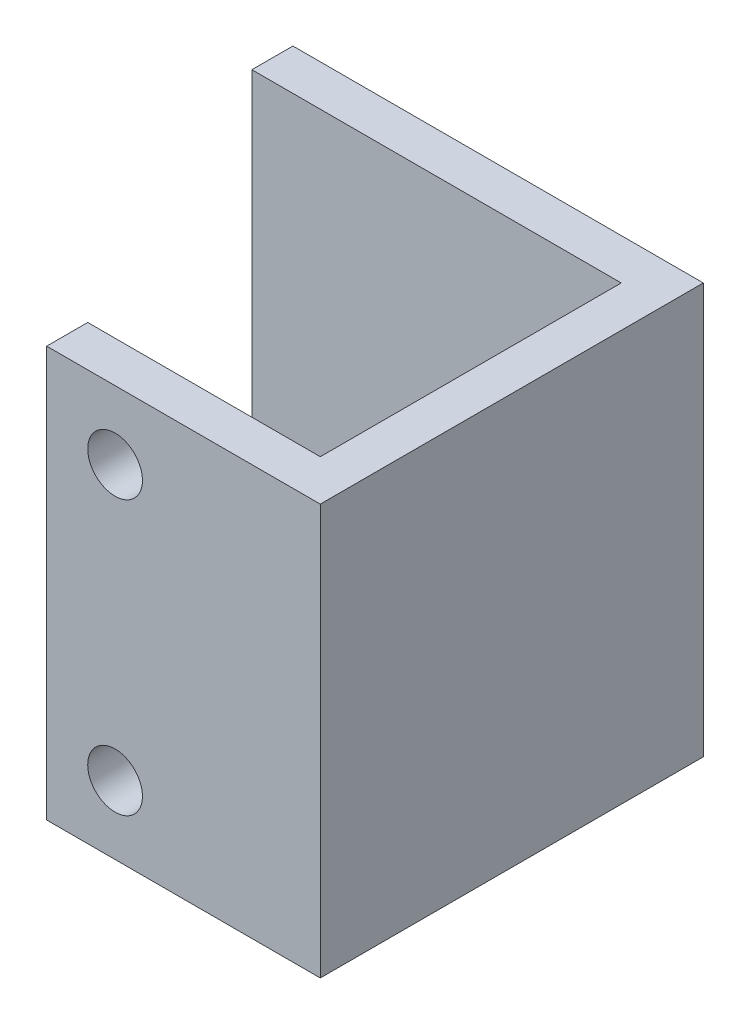
ISO-10303-21;
HEADER;
FILE_DESCRIPTION(('STEP AP214'),'2;1');
FILE_NAME('part.step','',(''),(''),'','','');
FILE_SCHEMA(('AUTOMOTIVE_DESIGN { 1 0 10303 214 1 1 1 1 }'));
ENDSEC;
DATA;
#1=APPLICATION_CONTEXT('core data for automotive mechanical design processes');
#2=APPLICATION_PROTOCOL_DEFINITION('international standard','automotive_design',2000,#1);
#3=PRODUCT_CONTEXT('',#1,'mechanical');
#4=PRODUCT('Part','Part','',(#3));
#5=PRODUCT_RELATED_PRODUCT_CATEGORY('part','',(#4));
#6=PRODUCT_DEFINITION_FORMATION('','',#4);
#7=PRODUCT_DEFINITION_CONTEXT('part definition',#1,'design');
#8=PRODUCT_DEFINITION('design','',#6,#7);
#9=PRODUCT_DEFINITION_SHAPE('','',#8);
#10=(LENGTH_UNIT() NAMED_UNIT(*) SI_UNIT(.MILLI.,.METRE.));
#11=(NAMED_UNIT(*) PLANE_ANGLE_UNIT() SI_UNIT($,.RADIAN.));
#12=(NAMED_UNIT(*) SI_UNIT($,.STERADIAN.) SOLID_ANGLE_UNIT());
#13=UNCERTAINTY_MEASURE_WITH_UNIT(LENGTH_MEASURE(1.E-05),#10,'distance_accuracy_value','');
#14=(GEOMETRIC_REPRESENTATION_CONTEXT(3) GLOBAL_UNCERTAINTY_ASSIGNED_CONTEXT((#13)) GLOBAL_UNIT_ASSIGNED_CONTEXT((#10,
#11,#12)) REPRESENTATION_CONTEXT('',''));
#15=CARTESIAN_POINT('',(0.,0.,0.));
#16=DIRECTION('',(0.,0.,1.));
#17=DIRECTION('',(1.,0.,0.));
#18=AXIS2_PLACEMENT_3D('',#15,#16,#17);
#19=CARTESIAN_POINT('',(0.,0.,3.));
#20=DIRECTION('',(0.,0.,-1.));
#21=DIRECTION('',(-1.,0.,0.));
#22=AXIS2_PLACEMENT_3D('',#19,#20,#21);
#23=PLANE('',#22);
#24=DIRECTION('',(0.,-1.,0.));
#25=VECTOR('',#24,1.);
#26=CARTESIAN_POINT('',(12.,15.,3.));
#27=LINE('',#26,#25);
#28=CARTESIAN_POINT('',(12.,15.,3.));
#29=VERTEX_POINT('',#28);
#30=CARTESIAN_POINT('',(12.,-15.,3.));
#31=VERTEX_POINT('',#30);
#32=EDGE_CURVE('E50',#29,#31,#27,.T.);
#33=ORIENTED_EDGE('',*,*,#32,.F.);
#34=DIRECTION('',(-1.,0.,0.));
#35=VECTOR('',#34,1.);
#36=CARTESIAN_POINT('',(-15.,15.,3.));
#37=LINE('',#36,#35);
#38=CARTESIAN_POINT('',(-15.,15.,3.));
#39=VERTEX_POINT('',#38);
#40=EDGE_CURVE('E88',#29,#39,#37,.T.);
#41=ORIENTED_EDGE('',*,*,#40,.T.);
#42=DIRECTION('',(0.,-1.,0.));
#43=VECTOR('',#42,1.);
#44=CARTESIAN_POINT('',(-15.,-15.,3.));
#45=LINE('',#44,#43);
#46=CARTESIAN_POINT('',(-15.,-15.,3.));
#47=VERTEX_POINT('',#46);
#48=EDGE_CURVE('E56',#39,#47,#45,.T.);
#49=ORIENTED_EDGE('',*,*,#48,.T.);
#50=DIRECTION('',(1.,0.,0.));
#51=VECTOR('',#50,1.);
#52=CARTESIAN_POINT('',(-15.,-15.,3.));
#53=LINE('',#52,#51);
#54=EDGE_CURVE('E98',#47,#31,#53,.T.);
#55=ORIENTED_EDGE('',*,*,#54,.T.);
#56=EDGE_LOOP('',(#33,#41,#49,#55));
#57=FACE_BOUND('',#56,.T.);
#58=ADVANCED_FACE('F35',(#57),#23,.F.);
#59=CARTESIAN_POINT('',(15.,-15.,3.));
#60=DIRECTION('',(-1.,0.,0.));
#61=DIRECTION('',(0.,0.,1.));
#62=AXIS2_PLACEMENT_3D('',#59,#60,#61);
#63=PLANE('',#62);
#64=DIRECTION('',(0.,1.,0.));
#65=VECTOR('',#64,1.);
#66=CARTESIAN_POINT('',(15.,-15.,0.));
#67=LINE('',#66,#65);
#68=CARTESIAN_POINT('',(15.,-15.,0.));
#69=VERTEX_POINT('',#68);
#70=CARTESIAN_POINT('',(15.,15.,0.));
#71=VERTEX_POINT('',#70);
#72=EDGE_CURVE('E95',#69,#71,#67,.T.);
#73=ORIENTED_EDGE('',*,*,#72,.T.);
#74=DIRECTION('',(0.,0.,-1.));
#75=VECTOR('',#74,1.);
#76=CARTESIAN_POINT('',(15.,15.,3.));
#77=LINE('',#76,#75);
#78=CARTESIAN_POINT('',(15.,15.,28.));
#79=VERTEX_POINT('',#78);
#80=EDGE_CURVE('E11',#79,#71,#77,.T.);
#81=ORIENTED_EDGE('',*,*,#80,.F.);
#82=DIRECTION('',(0.,1.,0.));
#83=VECTOR('',#82,1.);
#84=CARTESIAN_POINT('',(15.,15.,28.));
#85=LINE('',#84,#83);
#86=CARTESIAN_POINT('',(15.,-15.,28.));
#87=VERTEX_POINT('',#86);
#88=EDGE_CURVE('E97',#87,#79,#85,.T.);
#89=ORIENTED_EDGE('',*,*,#88,.F.);
#90=DIRECTION('',(0.,0.,-1.));
#91=VECTOR('',#90,1.);
#92=CARTESIAN_POINT('',(15.,-15.,3.));
#93=LINE('',#92,#91);
#94=EDGE_CURVE('E81',#87,#69,#93,.T.);
#95=ORIENTED_EDGE('',*,*,#94,.T.);
#96=EDGE_LOOP('',(#73,#81,#89,#95));
#97=FACE_BOUND('',#96,.T.);
#98=ADVANCED_FACE('F37',(#97),#63,.F.);
#99=CARTESIAN_POINT('',(-15.,15.,3.));
#100=DIRECTION('',(0.,-1.,0.));
#101=DIRECTION('',(0.,0.,-1.));
#102=AXIS2_PLACEMENT_3D('',#99,#100,#101);
#103=PLANE('',#102);
#104=DIRECTION('',(-1.,0.,0.));
#105=VECTOR('',#104,1.);
#106=CARTESIAN_POINT('',(-15.,15.,0.));
#107=LINE('',#106,#105);
#108=CARTESIAN_POINT('',(-15.,15.,0.));
#109=VERTEX_POINT('',#108);
#110=EDGE_CURVE('E101',#71,#109,#107,.T.);
#111=ORIENTED_EDGE('',*,*,#110,.T.);
#112=DIRECTION('',(0.,0.,-1.));
#113=VECTOR('',#112,1.);
#114=CARTESIAN_POINT('',(-15.,15.,3.));
#115=LINE('',#114,#113);
#116=EDGE_CURVE('E43',#39,#109,#115,.T.);
#117=ORIENTED_EDGE('',*,*,#116,.F.);
#118=ORIENTED_EDGE('',*,*,#40,.F.);
#119=DIRECTION('',(0.,0.,-1.));
#120=VECTOR('',#119,1.);
#121=CARTESIAN_POINT('',(12.,15.,25.));
#122=LINE('',#121,#120);
#123=CARTESIAN_POINT('',(12.,15.,25.));
#124=VERTEX_POINT('',#123);
#125=EDGE_CURVE('E102',#124,#29,#122,.T.);
#126=ORIENTED_EDGE('',*,*,#125,.F.);
#127=DIRECTION('',(-1.,0.,0.));
#128=VECTOR('',#127,1.);
#129=CARTESIAN_POINT('',(15.,15.,25.));
#130=LINE('',#129,#128);
#131=CARTESIAN_POINT('',(-5.,15.,25.));
#132=VERTEX_POINT('',#131);
#133=EDGE_CURVE('E166',#124,#132,#130,.T.);
#134=ORIENTED_EDGE('',*,*,#133,.T.);
#135=DIRECTION('',(0.,0.,-1.));
#136=VECTOR('',#135,1.);
#137=CARTESIAN_POINT('',(-5.,15.,28.));
#138=LINE('',#137,#136);
#139=CARTESIAN_POINT('',(-5.,15.,28.));
#140=VERTEX_POINT('',#139);
#141=EDGE_CURVE('E148',#140,#132,#138,.T.);
#142=ORIENTED_EDGE('',*,*,#141,.F.);
#143=DIRECTION('',(-1.,0.,0.));
#144=VECTOR('',#143,1.);
#145=CARTESIAN_POINT('',(15.,15.,28.));
#146=LINE('',#145,#144);
#147=EDGE_CURVE('E123',#79,#140,#146,.T.);
#148=ORIENTED_EDGE('',*,*,#147,.F.);
#149=ORIENTED_EDGE('',*,*,#80,.T.);
#150=EDGE_LOOP('',(#111,#117,#118,#126,#134,#142,#148,#149));
#151=FACE_BOUND('',#150,.T.);
#152=ADVANCED_FACE('F117',(#151),#103,.F.);
#153=CARTESIAN_POINT('',(-15.,-15.,3.));
#154=DIRECTION('',(1.,0.,0.));
#155=DIRECTION('',(0.,0.,-1.));
#156=AXIS2_PLACEMENT_3D('',#153,#154,#155);
#157=PLANE('',#156);
#158=DIRECTION('',(0.,-1.,0.));
#159=VECTOR('',#158,1.);
#160=CARTESIAN_POINT('',(-15.,-15.,0.));
#161=LINE('',#160,#159);
#162=CARTESIAN_POINT('',(-15.,-15.,0.));
#163=VERTEX_POINT('',#162);
#164=EDGE_CURVE('E89',#109,#163,#161,.T.);
#165=ORIENTED_EDGE('',*,*,#164,.T.);
#166=DIRECTION('',(0.,0.,-1.));
#167=VECTOR('',#166,1.);
#168=CARTESIAN_POINT('',(-15.,-15.,3.));
#169=LINE('',#168,#167);
#170=EDGE_CURVE('E84',#47,#163,#169,.T.);
#171=ORIENTED_EDGE('',*,*,#170,.F.);
#172=ORIENTED_EDGE('',*,*,#48,.F.);
#173=ORIENTED_EDGE('',*,*,#116,.T.);
#174=EDGE_LOOP('',(#165,#171,#172,#173));
#175=FACE_BOUND('',#174,.T.);
#176=ADVANCED_FACE('F115',(#175),#157,.F.);
#177=CARTESIAN_POINT('',(-15.,-15.,3.));
#178=DIRECTION('',(0.,1.,0.));
#179=DIRECTION('',(0.,0.,1.));
#180=AXIS2_PLACEMENT_3D('',#177,#178,#179);
#181=PLANE('',#180);
#182=DIRECTION('',(1.,0.,0.));
#183=VECTOR('',#182,1.);
#184=CARTESIAN_POINT('',(-15.,-15.,0.));
#185=LINE('',#184,#183);
#186=EDGE_CURVE('E76',#163,#69,#185,.T.);
#187=ORIENTED_EDGE('',*,*,#186,.T.);
#188=ORIENTED_EDGE('',*,*,#94,.F.);
#189=DIRECTION('',(1.,0.,0.));
#190=VECTOR('',#189,1.);
#191=CARTESIAN_POINT('',(15.,-15.,28.));
#192=LINE('',#191,#190);
#193=CARTESIAN_POINT('',(-5.,-15.,28.));
#194=VERTEX_POINT('',#193);
#195=EDGE_CURVE('E162',#194,#87,#192,.T.);
#196=ORIENTED_EDGE('',*,*,#195,.F.);
#197=DIRECTION('',(0.,0.,-1.));
#198=VECTOR('',#197,1.);
#199=CARTESIAN_POINT('',(-5.,-15.,28.));
#200=LINE('',#199,#198);
#201=CARTESIAN_POINT('',(-5.,-15.,25.));
#202=VERTEX_POINT('',#201);
#203=EDGE_CURVE('E160',#194,#202,#200,.T.);
#204=ORIENTED_EDGE('',*,*,#203,.T.);
#205=DIRECTION('',(1.,0.,0.));
#206=VECTOR('',#205,1.);
#207=CARTESIAN_POINT('',(15.,-15.,25.));
#208=LINE('',#207,#206);
#209=CARTESIAN_POINT('',(12.,-15.,25.));
#210=VERTEX_POINT('',#209);
#211=EDGE_CURVE('E153',#202,#210,#208,.T.);
#212=ORIENTED_EDGE('',*,*,#211,.T.);
#213=DIRECTION('',(0.,0.,-1.));
#214=VECTOR('',#213,1.);
#215=CARTESIAN_POINT('',(12.,-15.,25.));
#216=LINE('',#215,#214);
#217=EDGE_CURVE('E106',#210,#31,#216,.T.);
#218=ORIENTED_EDGE('',*,*,#217,.T.);
#219=ORIENTED_EDGE('',*,*,#54,.F.);
#220=ORIENTED_EDGE('',*,*,#170,.T.);
#221=EDGE_LOOP('',(#187,#188,#196,#204,#212,#218,#219,#220));
#222=FACE_BOUND('',#221,.T.);
#223=ADVANCED_FACE('F78',(#222),#181,.F.);
#224=CARTESIAN_POINT('',(0.,0.,0.));
#225=DIRECTION('',(0.,0.,-1.));
#226=DIRECTION('',(-1.,0.,0.));
#227=AXIS2_PLACEMENT_3D('',#224,#225,#226);
#228=PLANE('',#227);
#229=ORIENTED_EDGE('',*,*,#72,.F.);
#230=ORIENTED_EDGE('',*,*,#186,.F.);
#231=ORIENTED_EDGE('',*,*,#164,.F.);
#232=ORIENTED_EDGE('',*,*,#110,.F.);
#233=EDGE_LOOP('',(#229,#230,#231,#232));
#234=FACE_BOUND('',#233,.T.);
#235=ADVANCED_FACE('F100',(#234),#228,.T.);
#236=CARTESIAN_POINT('',(12.,15.,25.));
#237=DIRECTION('',(1.,0.,0.));
#238=DIRECTION('',(0.,1.,0.));
#239=AXIS2_PLACEMENT_3D('',#236,#237,#238);
#240=PLANE('',#239);
#241=ORIENTED_EDGE('',*,*,#32,.T.);
#242=ORIENTED_EDGE('',*,*,#217,.F.);
#243=DIRECTION('',(0.,-1.,0.));
#244=VECTOR('',#243,1.);
#245=CARTESIAN_POINT('',(12.,15.,25.));
#246=LINE('',#245,#244);
#247=EDGE_CURVE('E147',#124,#210,#246,.T.);
#248=ORIENTED_EDGE('',*,*,#247,.F.);
#249=ORIENTED_EDGE('',*,*,#125,.T.);
#250=EDGE_LOOP('',(#241,#242,#248,#249));
#251=FACE_BOUND('',#250,.T.);
#252=ADVANCED_FACE('F144',(#251),#240,.F.);
#253=CARTESIAN_POINT('',(0.,0.,28.));
#254=DIRECTION('',(0.,0.,-1.));
#255=DIRECTION('',(-1.,0.,0.));
#256=AXIS2_PLACEMENT_3D('',#253,#254,#255);
#257=PLANE('',#256);
#258=ORIENTED_EDGE('',*,*,#88,.T.);
#259=ORIENTED_EDGE('',*,*,#147,.T.);
#260=DIRECTION('',(0.,-1.,0.));
#261=VECTOR('',#260,1.);
#262=CARTESIAN_POINT('',(-5.,15.,28.));
#263=LINE('',#262,#261);
#264=EDGE_CURVE('E170',#140,#194,#263,.T.);
#265=ORIENTED_EDGE('',*,*,#264,.T.);
#266=ORIENTED_EDGE('',*,*,#195,.T.);
#267=EDGE_LOOP('',(#258,#259,#265,#266));
#268=FACE_BOUND('',#267,.T.);
#269=CARTESIAN_POINT('',(0.,10.,28.));
#270=DIRECTION('',(0.,0.,1.));
#271=DIRECTION('',(1.,0.,0.));
#272=AXIS2_PLACEMENT_3D('',#269,#270,#271);
#273=CIRCLE('',#272,2.);
#274=CARTESIAN_POINT('',(2.,10.,28.));
#275=VERTEX_POINT('',#274);
#276=EDGE_CURVE('E168',#275,#275,#273,.T.);
#277=ORIENTED_EDGE('',*,*,#276,.F.);
#278=EDGE_LOOP('',(#277));
#279=FACE_BOUND('',#278,.T.);
#280=CARTESIAN_POINT('',(0.,-10.,28.));
#281=DIRECTION('',(0.,0.,1.));
#282=DIRECTION('',(-1.,0.,0.));
#283=AXIS2_PLACEMENT_3D('',#280,#281,#282);
#284=CIRCLE('',#283,2.);
#285=CARTESIAN_POINT('',(-2.,-10.,28.));
#286=VERTEX_POINT('',#285);
#287=EDGE_CURVE('E177',#286,#286,#284,.T.);
#288=ORIENTED_EDGE('',*,*,#287,.F.);
#289=EDGE_LOOP('',(#288));
#290=FACE_BOUND('',#289,.T.);
#291=ADVANCED_FACE('F189',(#268,#279,#290),#257,.F.);
#292=CARTESIAN_POINT('',(0.,0.,25.));
#293=DIRECTION('',(0.,0.,-1.));
#294=DIRECTION('',(-1.,0.,0.));
#295=AXIS2_PLACEMENT_3D('',#292,#293,#294);
#296=PLANE('',#295);
#297=CARTESIAN_POINT('',(0.,10.,25.));
#298=DIRECTION('',(0.,0.,1.));
#299=DIRECTION('',(1.,0.,0.));
#300=AXIS2_PLACEMENT_3D('',#297,#298,#299);
#301=CIRCLE('',#300,2.);
#302=CARTESIAN_POINT('',(2.,10.,25.));
#303=VERTEX_POINT('',#302);
#304=EDGE_CURVE('E174',#303,#303,#301,.T.);
#305=ORIENTED_EDGE('',*,*,#304,.T.);
#306=EDGE_LOOP('',(#305));
#307=FACE_BOUND('',#306,.T.);
#308=ORIENTED_EDGE('',*,*,#133,.F.);
#309=ORIENTED_EDGE('',*,*,#247,.T.);
#310=ORIENTED_EDGE('',*,*,#211,.F.);
#311=DIRECTION('',(0.,-1.,0.));
#312=VECTOR('',#311,1.);
#313=CARTESIAN_POINT('',(-5.,15.,25.));
#314=LINE('',#313,#312);
#315=EDGE_CURVE('E164',#132,#202,#314,.T.);
#316=ORIENTED_EDGE('',*,*,#315,.F.);
#317=EDGE_LOOP('',(#308,#309,#310,#316));
#318=FACE_BOUND('',#317,.T.);
#319=CARTESIAN_POINT('',(0.,-10.,25.));
#320=DIRECTION('',(0.,0.,1.));
#321=DIRECTION('',(-1.,0.,0.));
#322=AXIS2_PLACEMENT_3D('',#319,#320,#321);
#323=CIRCLE('',#322,2.);
#324=CARTESIAN_POINT('',(-2.,-10.,25.));
#325=VERTEX_POINT('',#324);
#326=EDGE_CURVE('E180',#325,#325,#323,.T.);
#327=ORIENTED_EDGE('',*,*,#326,.T.);
#328=EDGE_LOOP('',(#327));
#329=FACE_BOUND('',#328,.T.);
#330=ADVANCED_FACE('F191',(#307,#318,#329),#296,.T.);
#331=CARTESIAN_POINT('',(-5.,15.,28.));
#332=DIRECTION('',(1.,0.,0.));
#333=DIRECTION('',(0.,1.,0.));
#334=AXIS2_PLACEMENT_3D('',#331,#332,#333);
#335=PLANE('',#334);
#336=ORIENTED_EDGE('',*,*,#315,.T.);
#337=ORIENTED_EDGE('',*,*,#203,.F.);
#338=ORIENTED_EDGE('',*,*,#264,.F.);
#339=ORIENTED_EDGE('',*,*,#141,.T.);
#340=EDGE_LOOP('',(#336,#337,#338,#339));
#341=FACE_BOUND('',#340,.T.);
#342=ADVANCED_FACE('F198',(#341),#335,.F.);
#343=CARTESIAN_POINT('',(0.,10.,28.));
#344=DIRECTION('',(0.,0.,-1.));
#345=DIRECTION('',(-1.,0.,0.));
#346=AXIS2_PLACEMENT_3D('',#343,#344,#345);
#347=CYLINDRICAL_SURFACE('',#346,2.);
#348=ORIENTED_EDGE('',*,*,#276,.T.);
#349=EDGE_LOOP('',(#348));
#350=FACE_BOUND('',#349,.T.);
#351=ORIENTED_EDGE('',*,*,#304,.F.);
#352=EDGE_LOOP('',(#351));
#353=FACE_BOUND('',#352,.T.);
#354=ADVANCED_FACE('F258',(#350,#353),#347,.F.);
#355=CARTESIAN_POINT('',(0.,-10.,28.));
#356=DIRECTION('',(0.,0.,-1.));
#357=DIRECTION('',(-1.,0.,0.));
#358=AXIS2_PLACEMENT_3D('',#355,#356,#357);
#359=CYLINDRICAL_SURFACE('',#358,2.);
#360=ORIENTED_EDGE('',*,*,#287,.T.);
#361=EDGE_LOOP('',(#360));
#362=FACE_BOUND('',#361,.T.);
#363=ORIENTED_EDGE('',*,*,#326,.F.);
#364=EDGE_LOOP('',(#363));
#365=FACE_BOUND('',#364,.T.);
#366=ADVANCED_FACE('F186',(#362,#365),#359,.F.);
#367=CLOSED_SHELL('',(#58,#98,#152,#176,#223,#235,#252,#291,#330,#342,#354,#366));
#368=MANIFOLD_SOLID_BREP('B2',#367);
#369=ADVANCED_BREP_SHAPE_REPRESENTATION('',(#18,#368),#14);
#370=SHAPE_DEFINITION_REPRESENTATION(#9,#369);
ENDSEC;
END-ISO-10303-21;
